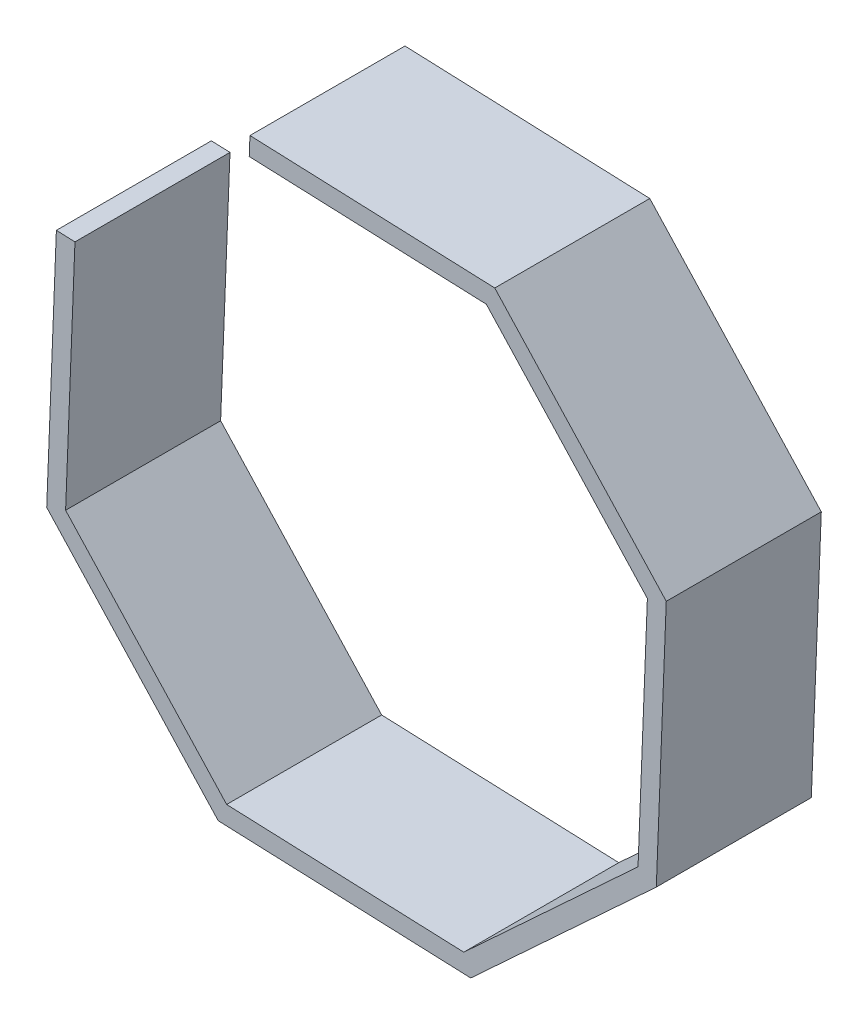
ISO-10303-21;
HEADER;
FILE_DESCRIPTION(('STEP AP214'),'2;1');
FILE_NAME('part.step','',(''),(''),'','','');
FILE_SCHEMA(('AUTOMOTIVE_DESIGN { 1 0 10303 214 1 1 1 1 }'));
ENDSEC;
DATA;
#1=APPLICATION_CONTEXT('core data for automotive mechanical design processes');
#2=APPLICATION_PROTOCOL_DEFINITION('international standard','automotive_design',2000,#1);
#3=PRODUCT_CONTEXT('',#1,'mechanical');
#4=PRODUCT('Part','Part','',(#3));
#5=PRODUCT_RELATED_PRODUCT_CATEGORY('part','',(#4));
#6=PRODUCT_DEFINITION_FORMATION('','',#4);
#7=PRODUCT_DEFINITION_CONTEXT('part definition',#1,'design');
#8=PRODUCT_DEFINITION('design','',#6,#7);
#9=PRODUCT_DEFINITION_SHAPE('','',#8);
#10=(LENGTH_UNIT() NAMED_UNIT(*) SI_UNIT(.MILLI.,.METRE.));
#11=(NAMED_UNIT(*) PLANE_ANGLE_UNIT() SI_UNIT($,.RADIAN.));
#12=(NAMED_UNIT(*) SI_UNIT($,.STERADIAN.) SOLID_ANGLE_UNIT());
#13=UNCERTAINTY_MEASURE_WITH_UNIT(LENGTH_MEASURE(1.E-05),#10,'distance_accuracy_value','');
#14=(GEOMETRIC_REPRESENTATION_CONTEXT(3) GLOBAL_UNCERTAINTY_ASSIGNED_CONTEXT((#13)) GLOBAL_UNIT_ASSIGNED_CONTEXT((#10,
#11,#12)) REPRESENTATION_CONTEXT('',''));
#15=CARTESIAN_POINT('',(0.,0.,0.));
#16=DIRECTION('',(0.,0.,1.));
#17=DIRECTION('',(1.,0.,0.));
#18=AXIS2_PLACEMENT_3D('',#15,#16,#17);
#19=CARTESIAN_POINT('',(21.0583913419168,48.4015290444842,25.));
#20=DIRECTION('',(-0.0394172251350906,-0.999222839191864,0.));
#21=DIRECTION('',(0.999222839191864,-0.0394172251350906,0.));
#22=AXIS2_PLACEMENT_3D('',#19,#20,#21);
#23=PLANE('',#22);
#24=DIRECTION('',(-0.999222839191864,0.0394172251350906,0.));
#25=VECTOR('',#24,1.);
#26=CARTESIAN_POINT('',(21.0583913419168,48.4015290444842,0.));
#27=LINE('',#26,#25);
#28=CARTESIAN_POINT('',(22.3000662973954,48.352547596758,0.));
#29=VERTEX_POINT('',#28);
#30=CARTESIAN_POINT('',(-17.1802112380363,49.9099609453846,0.));
#31=VERTEX_POINT('',#30);
#32=EDGE_CURVE('E176',#29,#31,#27,.T.);
#33=ORIENTED_EDGE('',*,*,#32,.T.);
#34=DIRECTION('',(0.,0.,-1.));
#35=VECTOR('',#34,1.);
#36=CARTESIAN_POINT('',(-17.1802112380363,49.9099609453846,25.));
#37=LINE('',#36,#35);
#38=CARTESIAN_POINT('',(-17.1802112380363,49.9099609453846,25.));
#39=VERTEX_POINT('',#38);
#40=EDGE_CURVE('E11',#39,#31,#37,.T.);
#41=ORIENTED_EDGE('',*,*,#40,.F.);
#42=DIRECTION('',(-0.999222839191864,0.0394172251350906,0.));
#43=VECTOR('',#42,1.);
#44=CARTESIAN_POINT('',(21.0583913419168,48.4015290444842,25.));
#45=LINE('',#44,#43);
#46=CARTESIAN_POINT('',(22.3000662973954,48.352547596758,25.));
#47=VERTEX_POINT('',#46);
#48=EDGE_CURVE('E113',#47,#39,#45,.T.);
#49=ORIENTED_EDGE('',*,*,#48,.F.);
#50=DIRECTION('',(0.,0.,-1.));
#51=VECTOR('',#50,1.);
#52=CARTESIAN_POINT('',(22.3000662973954,48.352547596758,25.));
#53=LINE('',#52,#51);
#54=EDGE_CURVE('E172',#47,#29,#53,.T.);
#55=ORIENTED_EDGE('',*,*,#54,.T.);
#56=EDGE_LOOP('',(#33,#41,#49,#55));
#57=FACE_BOUND('',#56,.T.);
#58=ADVANCED_FACE('F33',(#57),#23,.F.);
#59=CARTESIAN_POINT('',(-17.2984629134416,46.912292427809,25.));
#60=DIRECTION('',(-0.999222839191864,0.039417225135091,0.));
#61=DIRECTION('',(-0.039417225135091,-0.999222839191864,0.));
#62=AXIS2_PLACEMENT_3D('',#59,#60,#61);
#63=PLANE('',#62);
#64=DIRECTION('',(0.039417225135091,0.999222839191864,0.));
#65=VECTOR('',#64,1.);
#66=CARTESIAN_POINT('',(-17.2984629134416,46.912292427809,0.));
#67=LINE('',#66,#65);
#68=CARTESIAN_POINT('',(-17.2984629134416,46.912292427809,0.));
#69=VERTEX_POINT('',#68);
#70=EDGE_CURVE('E179',#69,#31,#67,.T.);
#71=ORIENTED_EDGE('',*,*,#70,.F.);
#72=DIRECTION('',(0.,0.,-1.));
#73=VECTOR('',#72,1.);
#74=CARTESIAN_POINT('',(-17.2984629134416,46.912292427809,25.));
#75=LINE('',#74,#73);
#76=CARTESIAN_POINT('',(-17.2984629134416,46.912292427809,25.));
#77=VERTEX_POINT('',#76);
#78=EDGE_CURVE('E41',#77,#69,#75,.T.);
#79=ORIENTED_EDGE('',*,*,#78,.F.);
#80=DIRECTION('',(0.039417225135091,0.999222839191864,0.));
#81=VECTOR('',#80,1.);
#82=CARTESIAN_POINT('',(-17.2984629134416,46.912292427809,25.));
#83=LINE('',#82,#81);
#84=EDGE_CURVE('E261',#77,#39,#83,.T.);
#85=ORIENTED_EDGE('',*,*,#84,.T.);
#86=ORIENTED_EDGE('',*,*,#40,.T.);
#87=EDGE_LOOP('',(#71,#79,#85,#86));
#88=FACE_BOUND('',#87,.T.);
#89=ADVANCED_FACE('F248',(#88),#63,.T.);
#90=CARTESIAN_POINT('',(20.9401396665115,45.4038605269086,25.));
#91=DIRECTION('',(-0.0394172251350906,-0.999222839191864,0.));
#92=DIRECTION('',(0.999222839191864,-0.0394172251350906,0.));
#93=AXIS2_PLACEMENT_3D('',#90,#91,#92);
#94=PLANE('',#93);
#95=DIRECTION('',(-0.999222839191864,0.0394172251350906,0.));
#96=VECTOR('',#95,1.);
#97=CARTESIAN_POINT('',(20.9401396665115,45.4038605269086,0.));
#98=LINE('',#97,#96);
#99=CARTESIAN_POINT('',(20.9401396665115,45.4038605269086,0.));
#100=VERTEX_POINT('',#99);
#101=EDGE_CURVE('E182',#100,#69,#98,.T.);
#102=ORIENTED_EDGE('',*,*,#101,.F.);
#103=DIRECTION('',(0.,0.,-1.));
#104=VECTOR('',#103,1.);
#105=CARTESIAN_POINT('',(20.9401396665115,45.4038605269086,25.));
#106=LINE('',#105,#104);
#107=CARTESIAN_POINT('',(20.9401396665115,45.4038605269086,25.));
#108=VERTEX_POINT('',#107);
#109=EDGE_CURVE('E238',#108,#100,#106,.T.);
#110=ORIENTED_EDGE('',*,*,#109,.F.);
#111=DIRECTION('',(-0.999222839191864,0.0394172251350906,0.));
#112=VECTOR('',#111,1.);
#113=CARTESIAN_POINT('',(20.9401396665115,45.4038605269086,25.));
#114=LINE('',#113,#112);
#115=EDGE_CURVE('E245',#108,#77,#114,.T.);
#116=ORIENTED_EDGE('',*,*,#115,.T.);
#117=ORIENTED_EDGE('',*,*,#78,.T.);
#118=EDGE_LOOP('',(#102,#110,#116,#117));
#119=FACE_BOUND('',#118,.T.);
#120=ADVANCED_FACE('F243',(#119),#94,.T.);
#121=CARTESIAN_POINT('',(46.9122924278089,17.2984629134416,25.));
#122=DIRECTION('',(-0.734429432697622,-0.678685058320463,0.));
#123=DIRECTION('',(0.678685058320463,-0.734429432697622,0.));
#124=AXIS2_PLACEMENT_3D('',#121,#122,#123);
#125=PLANE('',#124);
#126=DIRECTION('',(-0.678685058320463,0.734429432697622,0.));
#127=VECTOR('',#126,1.);
#128=CARTESIAN_POINT('',(46.9122924278089,17.2984629134416,0.));
#129=LINE('',#128,#127);
#130=CARTESIAN_POINT('',(46.9122924278089,17.2984629134416,0.));
#131=VERTEX_POINT('',#130);
#132=EDGE_CURVE('E185',#131,#100,#129,.T.);
#133=ORIENTED_EDGE('',*,*,#132,.F.);
#134=DIRECTION('',(0.,0.,-1.));
#135=VECTOR('',#134,1.);
#136=CARTESIAN_POINT('',(46.9122924278089,17.2984629134416,25.));
#137=LINE('',#136,#135);
#138=CARTESIAN_POINT('',(46.9122924278089,17.2984629134416,25.));
#139=VERTEX_POINT('',#138);
#140=EDGE_CURVE('E236',#139,#131,#137,.T.);
#141=ORIENTED_EDGE('',*,*,#140,.F.);
#142=DIRECTION('',(-0.678685058320463,0.734429432697622,0.));
#143=VECTOR('',#142,1.);
#144=CARTESIAN_POINT('',(46.9122924278089,17.2984629134416,25.));
#145=LINE('',#144,#143);
#146=EDGE_CURVE('E258',#139,#108,#145,.T.);
#147=ORIENTED_EDGE('',*,*,#146,.T.);
#148=ORIENTED_EDGE('',*,*,#109,.T.);
#149=EDGE_LOOP('',(#133,#141,#147,#148));
#150=FACE_BOUND('',#149,.T.);
#151=ADVANCED_FACE('F255',(#150),#125,.T.);
#152=CARTESIAN_POINT('',(45.4038605269086,-20.9401396665115,25.));
#153=DIRECTION('',(-0.999222839191864,0.0394172251350904,0.));
#154=DIRECTION('',(-0.0394172251350904,-0.999222839191864,0.));
#155=AXIS2_PLACEMENT_3D('',#152,#153,#154);
#156=PLANE('',#155);
#157=DIRECTION('',(0.0394172251350904,0.999222839191864,0.));
#158=VECTOR('',#157,1.);
#159=CARTESIAN_POINT('',(45.4038605269086,-20.9401396665115,0.));
#160=LINE('',#159,#158);
#161=CARTESIAN_POINT('',(45.4038605269086,-20.9401396665115,0.));
#162=VERTEX_POINT('',#161);
#163=EDGE_CURVE('E188',#162,#131,#160,.T.);
#164=ORIENTED_EDGE('',*,*,#163,.F.);
#165=DIRECTION('',(0.,0.,-1.));
#166=VECTOR('',#165,1.);
#167=CARTESIAN_POINT('',(45.4038605269086,-20.9401396665115,25.));
#168=LINE('',#167,#166);
#169=CARTESIAN_POINT('',(45.4038605269086,-20.9401396665115,25.));
#170=VERTEX_POINT('',#169);
#171=EDGE_CURVE('E234',#170,#162,#168,.T.);
#172=ORIENTED_EDGE('',*,*,#171,.F.);
#173=DIRECTION('',(0.0394172251350904,0.999222839191864,0.));
#174=VECTOR('',#173,1.);
#175=CARTESIAN_POINT('',(45.4038605269086,-20.9401396665115,25.));
#176=LINE('',#175,#174);
#177=EDGE_CURVE('E263',#170,#139,#176,.T.);
#178=ORIENTED_EDGE('',*,*,#177,.T.);
#179=ORIENTED_EDGE('',*,*,#140,.T.);
#180=EDGE_LOOP('',(#164,#172,#178,#179));
#181=FACE_BOUND('',#180,.T.);
#182=ADVANCED_FACE('F320',(#181),#156,.T.);
#183=CARTESIAN_POINT('',(17.2984629134416,-46.912292427809,25.));
#184=DIRECTION('',(-0.678685058320462,0.734429432697622,0.));
#185=DIRECTION('',(-0.734429432697622,-0.678685058320462,0.));
#186=AXIS2_PLACEMENT_3D('',#183,#184,#185);
#187=PLANE('',#186);
#188=DIRECTION('',(0.734429432697622,0.678685058320463,0.));
#189=VECTOR('',#188,1.);
#190=CARTESIAN_POINT('',(17.2984629134416,-46.912292427809,0.));
#191=LINE('',#190,#189);
#192=CARTESIAN_POINT('',(17.2984629134416,-46.912292427809,0.));
#193=VERTEX_POINT('',#192);
#194=EDGE_CURVE('E191',#193,#162,#191,.T.);
#195=ORIENTED_EDGE('',*,*,#194,.F.);
#196=DIRECTION('',(0.,0.,-1.));
#197=VECTOR('',#196,1.);
#198=CARTESIAN_POINT('',(17.2984629134416,-46.912292427809,25.));
#199=LINE('',#198,#197);
#200=CARTESIAN_POINT('',(17.2984629134416,-46.912292427809,25.));
#201=VERTEX_POINT('',#200);
#202=EDGE_CURVE('E232',#201,#193,#199,.T.);
#203=ORIENTED_EDGE('',*,*,#202,.F.);
#204=DIRECTION('',(0.734429432697622,0.678685058320463,0.));
#205=VECTOR('',#204,1.);
#206=CARTESIAN_POINT('',(17.2984629134416,-46.912292427809,25.));
#207=LINE('',#206,#205);
#208=EDGE_CURVE('E269',#201,#170,#207,.T.);
#209=ORIENTED_EDGE('',*,*,#208,.T.);
#210=ORIENTED_EDGE('',*,*,#171,.T.);
#211=EDGE_LOOP('',(#195,#203,#209,#210));
#212=FACE_BOUND('',#211,.T.);
#213=ADVANCED_FACE('F323',(#212),#187,.T.);
#214=CARTESIAN_POINT('',(-20.9401396665115,-45.4038605269086,25.));
#215=DIRECTION('',(0.0394172251350906,0.999222839191864,0.));
#216=DIRECTION('',(-0.999222839191864,0.0394172251350906,0.));
#217=AXIS2_PLACEMENT_3D('',#214,#215,#216);
#218=PLANE('',#217);
#219=DIRECTION('',(0.999222839191864,-0.0394172251350905,0.));
#220=VECTOR('',#219,1.);
#221=CARTESIAN_POINT('',(-20.9401396665115,-45.4038605269086,0.));
#222=LINE('',#221,#220);
#223=CARTESIAN_POINT('',(-20.9401396665115,-45.4038605269086,0.));
#224=VERTEX_POINT('',#223);
#225=EDGE_CURVE('E194',#224,#193,#222,.T.);
#226=ORIENTED_EDGE('',*,*,#225,.F.);
#227=DIRECTION('',(0.,0.,-1.));
#228=VECTOR('',#227,1.);
#229=CARTESIAN_POINT('',(-20.9401396665115,-45.4038605269086,25.));
#230=LINE('',#229,#228);
#231=CARTESIAN_POINT('',(-20.9401396665115,-45.4038605269086,25.));
#232=VERTEX_POINT('',#231);
#233=EDGE_CURVE('E230',#232,#224,#230,.T.);
#234=ORIENTED_EDGE('',*,*,#233,.F.);
#235=DIRECTION('',(0.999222839191864,-0.0394172251350905,0.));
#236=VECTOR('',#235,1.);
#237=CARTESIAN_POINT('',(-20.9401396665115,-45.4038605269086,25.));
#238=LINE('',#237,#236);
#239=EDGE_CURVE('E272',#232,#201,#238,.T.);
#240=ORIENTED_EDGE('',*,*,#239,.T.);
#241=ORIENTED_EDGE('',*,*,#202,.T.);
#242=EDGE_LOOP('',(#226,#234,#240,#241));
#243=FACE_BOUND('',#242,.T.);
#244=ADVANCED_FACE('F327',(#243),#218,.T.);
#245=CARTESIAN_POINT('',(-46.912292427809,-17.2984629134416,25.));
#246=DIRECTION('',(0.734429432697622,0.678685058320463,0.));
#247=DIRECTION('',(-0.678685058320463,0.734429432697622,0.));
#248=AXIS2_PLACEMENT_3D('',#245,#246,#247);
#249=PLANE('',#248);
#250=DIRECTION('',(0.678685058320463,-0.734429432697622,0.));
#251=VECTOR('',#250,1.);
#252=CARTESIAN_POINT('',(-46.912292427809,-17.2984629134416,0.));
#253=LINE('',#252,#251);
#254=CARTESIAN_POINT('',(-46.912292427809,-17.2984629134416,0.));
#255=VERTEX_POINT('',#254);
#256=EDGE_CURVE('E197',#255,#224,#253,.T.);
#257=ORIENTED_EDGE('',*,*,#256,.F.);
#258=DIRECTION('',(0.,0.,-1.));
#259=VECTOR('',#258,1.);
#260=CARTESIAN_POINT('',(-46.912292427809,-17.2984629134416,25.));
#261=LINE('',#260,#259);
#262=CARTESIAN_POINT('',(-46.912292427809,-17.2984629134416,25.));
#263=VERTEX_POINT('',#262);
#264=EDGE_CURVE('E228',#263,#255,#261,.T.);
#265=ORIENTED_EDGE('',*,*,#264,.F.);
#266=DIRECTION('',(0.678685058320463,-0.734429432697622,0.));
#267=VECTOR('',#266,1.);
#268=CARTESIAN_POINT('',(-46.912292427809,-17.2984629134416,25.));
#269=LINE('',#268,#267);
#270=EDGE_CURVE('E275',#263,#232,#269,.T.);
#271=ORIENTED_EDGE('',*,*,#270,.T.);
#272=ORIENTED_EDGE('',*,*,#233,.T.);
#273=EDGE_LOOP('',(#257,#265,#271,#272));
#274=FACE_BOUND('',#273,.T.);
#275=ADVANCED_FACE('F331',(#274),#249,.T.);
#276=CARTESIAN_POINT('',(-45.4038605269086,20.9401396665115,25.));
#277=DIRECTION('',(0.999222839191864,-0.0394172251350905,0.));
#278=DIRECTION('',(0.0394172251350905,0.999222839191864,0.));
#279=AXIS2_PLACEMENT_3D('',#276,#277,#278);
#280=PLANE('',#279);
#281=DIRECTION('',(-0.0394172251350905,-0.999222839191864,0.));
#282=VECTOR('',#281,1.);
#283=CARTESIAN_POINT('',(-45.4038605269086,20.9401396665115,0.));
#284=LINE('',#283,#282);
#285=CARTESIAN_POINT('',(-45.4038605269086,20.9401396665115,0.));
#286=VERTEX_POINT('',#285);
#287=EDGE_CURVE('E200',#286,#255,#284,.T.);
#288=ORIENTED_EDGE('',*,*,#287,.F.);
#289=DIRECTION('',(0.,0.,-1.));
#290=VECTOR('',#289,1.);
#291=CARTESIAN_POINT('',(-45.4038605269086,20.9401396665115,25.));
#292=LINE('',#291,#290);
#293=CARTESIAN_POINT('',(-45.4038605269086,20.9401396665115,25.));
#294=VERTEX_POINT('',#293);
#295=EDGE_CURVE('E226',#294,#286,#292,.T.);
#296=ORIENTED_EDGE('',*,*,#295,.F.);
#297=DIRECTION('',(-0.0394172251350905,-0.999222839191864,0.));
#298=VECTOR('',#297,1.);
#299=CARTESIAN_POINT('',(-45.4038605269086,20.9401396665115,25.));
#300=LINE('',#299,#298);
#301=EDGE_CURVE('E278',#294,#263,#300,.T.);
#302=ORIENTED_EDGE('',*,*,#301,.T.);
#303=ORIENTED_EDGE('',*,*,#264,.T.);
#304=EDGE_LOOP('',(#288,#296,#302,#303));
#305=FACE_BOUND('',#304,.T.);
#306=ADVANCED_FACE('F335',(#305),#280,.T.);
#307=CARTESIAN_POINT('',(-48.4015290444842,21.0583913419168,25.));
#308=DIRECTION('',(0.0394172251350911,0.999222839191864,0.));
#309=DIRECTION('',(-0.999222839191864,0.0394172251350911,0.));
#310=AXIS2_PLACEMENT_3D('',#307,#308,#309);
#311=PLANE('',#310);
#312=DIRECTION('',(0.999222839191864,-0.0394172251350911,0.));
#313=VECTOR('',#312,1.);
#314=CARTESIAN_POINT('',(-48.4015290444842,21.0583913419168,0.));
#315=LINE('',#314,#313);
#316=CARTESIAN_POINT('',(-48.4015290444842,21.0583913419168,0.));
#317=VERTEX_POINT('',#316);
#318=EDGE_CURVE('E203',#317,#286,#315,.T.);
#319=ORIENTED_EDGE('',*,*,#318,.F.);
#320=DIRECTION('',(0.,0.,-1.));
#321=VECTOR('',#320,1.);
#322=CARTESIAN_POINT('',(-48.4015290444842,21.0583913419168,25.));
#323=LINE('',#322,#321);
#324=CARTESIAN_POINT('',(-48.4015290444842,21.0583913419168,25.));
#325=VERTEX_POINT('',#324);
#326=EDGE_CURVE('E224',#325,#317,#323,.T.);
#327=ORIENTED_EDGE('',*,*,#326,.F.);
#328=DIRECTION('',(0.999222839191864,-0.0394172251350911,0.));
#329=VECTOR('',#328,1.);
#330=CARTESIAN_POINT('',(-48.4015290444842,21.0583913419168,25.));
#331=LINE('',#330,#329);
#332=EDGE_CURVE('E281',#325,#294,#331,.T.);
#333=ORIENTED_EDGE('',*,*,#332,.T.);
#334=ORIENTED_EDGE('',*,*,#295,.T.);
#335=EDGE_LOOP('',(#319,#327,#333,#334));
#336=FACE_BOUND('',#335,.T.);
#337=ADVANCED_FACE('F339',(#336),#311,.T.);
#338=CARTESIAN_POINT('',(-48.4015290444842,21.0583913419168,25.));
#339=DIRECTION('',(0.999222839191864,-0.0394172251350905,0.));
#340=DIRECTION('',(0.0394172251350905,0.999222839191864,0.));
#341=AXIS2_PLACEMENT_3D('',#338,#339,#340);
#342=PLANE('',#341);
#343=DIRECTION('',(-0.0394172251350905,-0.999222839191864,0.));
#344=VECTOR('',#343,1.);
#345=CARTESIAN_POINT('',(-48.4015290444842,21.0583913419168,0.));
#346=LINE('',#345,#344);
#347=CARTESIAN_POINT('',(-49.9589423931108,-18.421886193515,0.));
#348=VERTEX_POINT('',#347);
#349=EDGE_CURVE('E206',#317,#348,#346,.T.);
#350=ORIENTED_EDGE('',*,*,#349,.T.);
#351=DIRECTION('',(0.,0.,-1.));
#352=VECTOR('',#351,1.);
#353=CARTESIAN_POINT('',(-49.9589423931108,-18.421886193515,25.));
#354=LINE('',#353,#352);
#355=CARTESIAN_POINT('',(-49.9589423931108,-18.421886193515,25.));
#356=VERTEX_POINT('',#355);
#357=EDGE_CURVE('E221',#356,#348,#354,.T.);
#358=ORIENTED_EDGE('',*,*,#357,.F.);
#359=DIRECTION('',(-0.0394172251350905,-0.999222839191864,0.));
#360=VECTOR('',#359,1.);
#361=CARTESIAN_POINT('',(-48.4015290444842,21.0583913419168,25.));
#362=LINE('',#361,#360);
#363=EDGE_CURVE('E284',#325,#356,#362,.T.);
#364=ORIENTED_EDGE('',*,*,#363,.F.);
#365=ORIENTED_EDGE('',*,*,#326,.T.);
#366=EDGE_LOOP('',(#350,#358,#364,#365));
#367=FACE_BOUND('',#366,.T.);
#368=ADVANCED_FACE('F343',(#367),#342,.F.);
#369=CARTESIAN_POINT('',(-49.1155807259018,-19.334518088403,25.));
#370=DIRECTION('',(0.734429432697622,0.678685058320463,0.));
#371=DIRECTION('',(-0.678685058320463,0.734429432697622,0.));
#372=AXIS2_PLACEMENT_3D('',#369,#370,#371);
#373=PLANE('',#372);
#374=DIRECTION('',(0.678685058320463,-0.734429432697622,0.));
#375=VECTOR('',#374,1.);
#376=CARTESIAN_POINT('',(-49.1155807259018,-19.334518088403,0.));
#377=LINE('',#376,#375);
#378=CARTESIAN_POINT('',(-22.3000662973955,-48.352547596758,0.));
#379=VERTEX_POINT('',#378);
#380=EDGE_CURVE('E208',#348,#379,#377,.T.);
#381=ORIENTED_EDGE('',*,*,#380,.T.);
#382=DIRECTION('',(0.,0.,-1.));
#383=VECTOR('',#382,1.);
#384=CARTESIAN_POINT('',(-22.3000662973955,-48.352547596758,25.));
#385=LINE('',#384,#383);
#386=CARTESIAN_POINT('',(-22.3000662973955,-48.352547596758,25.));
#387=VERTEX_POINT('',#386);
#388=EDGE_CURVE('E218',#387,#379,#385,.T.);
#389=ORIENTED_EDGE('',*,*,#388,.F.);
#390=DIRECTION('',(0.678685058320463,-0.734429432697622,0.));
#391=VECTOR('',#390,1.);
#392=CARTESIAN_POINT('',(-49.1155807259018,-19.334518088403,25.));
#393=LINE('',#392,#391);
#394=EDGE_CURVE('E286',#356,#387,#393,.T.);
#395=ORIENTED_EDGE('',*,*,#394,.F.);
#396=ORIENTED_EDGE('',*,*,#357,.T.);
#397=EDGE_LOOP('',(#381,#389,#395,#396));
#398=FACE_BOUND('',#397,.T.);
#399=ADVANCED_FACE('F293',(#398),#373,.F.);
#400=CARTESIAN_POINT('',(-21.0583913419168,-48.4015290444842,25.));
#401=DIRECTION('',(0.0394172251350906,0.999222839191864,0.));
#402=DIRECTION('',(-0.999222839191864,0.0394172251350906,0.));
#403=AXIS2_PLACEMENT_3D('',#400,#401,#402);
#404=PLANE('',#403);
#405=DIRECTION('',(0.999222839191864,-0.0394172251350905,0.));
#406=VECTOR('',#405,1.);
#407=CARTESIAN_POINT('',(-21.0583913419168,-48.4015290444842,0.));
#408=LINE('',#407,#406);
#409=CARTESIAN_POINT('',(18.4218861935149,-49.9589423931108,0.));
#410=VERTEX_POINT('',#409);
#411=EDGE_CURVE('E210',#379,#410,#408,.T.);
#412=ORIENTED_EDGE('',*,*,#411,.T.);
#413=DIRECTION('',(0.,0.,-1.));
#414=VECTOR('',#413,1.);
#415=CARTESIAN_POINT('',(18.4218861935149,-49.9589423931108,25.));
#416=LINE('',#415,#414);
#417=CARTESIAN_POINT('',(18.4218861935149,-49.9589423931108,25.));
#418=VERTEX_POINT('',#417);
#419=EDGE_CURVE('E167',#418,#410,#416,.T.);
#420=ORIENTED_EDGE('',*,*,#419,.F.);
#421=DIRECTION('',(0.999222839191864,-0.0394172251350905,0.));
#422=VECTOR('',#421,1.);
#423=CARTESIAN_POINT('',(-21.0583913419168,-48.4015290444842,25.));
#424=LINE('',#423,#422);
#425=EDGE_CURVE('E158',#387,#418,#424,.T.);
#426=ORIENTED_EDGE('',*,*,#425,.F.);
#427=ORIENTED_EDGE('',*,*,#388,.T.);
#428=EDGE_LOOP('',(#412,#420,#426,#427));
#429=FACE_BOUND('',#428,.T.);
#430=ADVANCED_FACE('F297',(#429),#404,.F.);
#431=CARTESIAN_POINT('',(19.3345180884029,-49.1155807259018,25.));
#432=DIRECTION('',(-0.678685058320462,0.734429432697622,0.));
#433=DIRECTION('',(-0.734429432697622,-0.678685058320462,0.));
#434=AXIS2_PLACEMENT_3D('',#431,#432,#433);
#435=PLANE('',#434);
#436=DIRECTION('',(0.734429432697622,0.678685058320462,0.));
#437=VECTOR('',#436,1.);
#438=CARTESIAN_POINT('',(19.3345180884029,-49.1155807259018,0.));
#439=LINE('',#438,#437);
#440=CARTESIAN_POINT('',(48.352547596758,-22.3000662973954,0.));
#441=VERTEX_POINT('',#440);
#442=EDGE_CURVE('E166',#410,#441,#439,.T.);
#443=ORIENTED_EDGE('',*,*,#442,.T.);
#444=DIRECTION('',(0.,0.,-1.));
#445=VECTOR('',#444,1.);
#446=CARTESIAN_POINT('',(48.352547596758,-22.3000662973954,25.));
#447=LINE('',#446,#445);
#448=CARTESIAN_POINT('',(48.352547596758,-22.3000662973954,25.));
#449=VERTEX_POINT('',#448);
#450=EDGE_CURVE('E163',#449,#441,#447,.T.);
#451=ORIENTED_EDGE('',*,*,#450,.F.);
#452=DIRECTION('',(0.734429432697622,0.678685058320462,0.));
#453=VECTOR('',#452,1.);
#454=CARTESIAN_POINT('',(19.3345180884029,-49.1155807259018,25.));
#455=LINE('',#454,#453);
#456=EDGE_CURVE('E152',#418,#449,#455,.T.);
#457=ORIENTED_EDGE('',*,*,#456,.F.);
#458=ORIENTED_EDGE('',*,*,#419,.T.);
#459=EDGE_LOOP('',(#443,#451,#457,#458));
#460=FACE_BOUND('',#459,.T.);
#461=ADVANCED_FACE('F164',(#460),#435,.F.);
#462=CARTESIAN_POINT('',(48.4015290444842,-21.0583913419168,25.));
#463=DIRECTION('',(-0.999222839191864,0.0394172251350904,0.));
#464=DIRECTION('',(-0.0394172251350904,-0.999222839191864,0.));
#465=AXIS2_PLACEMENT_3D('',#462,#463,#464);
#466=PLANE('',#465);
#467=DIRECTION('',(0.0394172251350904,0.999222839191864,0.));
#468=VECTOR('',#467,1.);
#469=CARTESIAN_POINT('',(48.4015290444842,-21.0583913419168,0.));
#470=LINE('',#469,#468);
#471=CARTESIAN_POINT('',(49.9589423931108,18.421886193515,0.));
#472=VERTEX_POINT('',#471);
#473=EDGE_CURVE('E101',#441,#472,#470,.T.);
#474=ORIENTED_EDGE('',*,*,#473,.T.);
#475=DIRECTION('',(0.,0.,-1.));
#476=VECTOR('',#475,1.);
#477=CARTESIAN_POINT('',(49.9589423931108,18.421886193515,25.));
#478=LINE('',#477,#476);
#479=CARTESIAN_POINT('',(49.9589423931108,18.421886193515,25.));
#480=VERTEX_POINT('',#479);
#481=EDGE_CURVE('E168',#480,#472,#478,.T.);
#482=ORIENTED_EDGE('',*,*,#481,.F.);
#483=DIRECTION('',(0.0394172251350904,0.999222839191864,0.));
#484=VECTOR('',#483,1.);
#485=CARTESIAN_POINT('',(48.4015290444842,-21.0583913419168,25.));
#486=LINE('',#485,#484);
#487=EDGE_CURVE('E156',#449,#480,#486,.T.);
#488=ORIENTED_EDGE('',*,*,#487,.F.);
#489=ORIENTED_EDGE('',*,*,#450,.T.);
#490=EDGE_LOOP('',(#474,#482,#488,#489));
#491=FACE_BOUND('',#490,.T.);
#492=ADVANCED_FACE('F170',(#491),#466,.F.);
#493=CARTESIAN_POINT('',(49.1155807259018,19.334518088403,25.));
#494=DIRECTION('',(-0.734429432697622,-0.678685058320463,0.));
#495=DIRECTION('',(0.678685058320463,-0.734429432697622,0.));
#496=AXIS2_PLACEMENT_3D('',#493,#494,#495);
#497=PLANE('',#496);
#498=DIRECTION('',(-0.678685058320463,0.734429432697622,0.));
#499=VECTOR('',#498,1.);
#500=CARTESIAN_POINT('',(49.1155807259018,19.334518088403,0.));
#501=LINE('',#500,#499);
#502=EDGE_CURVE('E107',#472,#29,#501,.T.);
#503=ORIENTED_EDGE('',*,*,#502,.T.);
#504=ORIENTED_EDGE('',*,*,#54,.F.);
#505=DIRECTION('',(-0.678685058320463,0.734429432697622,0.));
#506=VECTOR('',#505,1.);
#507=CARTESIAN_POINT('',(49.1155807259018,19.334518088403,25.));
#508=LINE('',#507,#506);
#509=EDGE_CURVE('E49',#480,#47,#508,.T.);
#510=ORIENTED_EDGE('',*,*,#509,.F.);
#511=ORIENTED_EDGE('',*,*,#481,.T.);
#512=EDGE_LOOP('',(#503,#504,#510,#511));
#513=FACE_BOUND('',#512,.T.);
#514=ADVANCED_FACE('F299',(#513),#497,.F.);
#515=CARTESIAN_POINT('',(0.,0.,25.));
#516=DIRECTION('',(0.,0.,-1.));
#517=DIRECTION('',(-1.,0.,0.));
#518=AXIS2_PLACEMENT_3D('',#515,#516,#517);
#519=PLANE('',#518);
#520=ORIENTED_EDGE('',*,*,#48,.T.);
#521=ORIENTED_EDGE('',*,*,#84,.F.);
#522=ORIENTED_EDGE('',*,*,#115,.F.);
#523=ORIENTED_EDGE('',*,*,#146,.F.);
#524=ORIENTED_EDGE('',*,*,#177,.F.);
#525=ORIENTED_EDGE('',*,*,#208,.F.);
#526=ORIENTED_EDGE('',*,*,#239,.F.);
#527=ORIENTED_EDGE('',*,*,#270,.F.);
#528=ORIENTED_EDGE('',*,*,#301,.F.);
#529=ORIENTED_EDGE('',*,*,#332,.F.);
#530=ORIENTED_EDGE('',*,*,#363,.T.);
#531=ORIENTED_EDGE('',*,*,#394,.T.);
#532=ORIENTED_EDGE('',*,*,#425,.T.);
#533=ORIENTED_EDGE('',*,*,#456,.T.);
#534=ORIENTED_EDGE('',*,*,#487,.T.);
#535=ORIENTED_EDGE('',*,*,#509,.T.);
#536=EDGE_LOOP('',(#520,#521,#522,#523,#524,#525,#526,#527,#528,#529,#530,#531,#532,#533,#534,#535));
#537=FACE_BOUND('',#536,.T.);
#538=ADVANCED_FACE('F154',(#537),#519,.F.);
#539=CARTESIAN_POINT('',(0.,0.,0.));
#540=DIRECTION('',(0.,0.,-1.));
#541=DIRECTION('',(-1.,0.,0.));
#542=AXIS2_PLACEMENT_3D('',#539,#540,#541);
#543=PLANE('',#542);
#544=ORIENTED_EDGE('',*,*,#32,.F.);
#545=ORIENTED_EDGE('',*,*,#502,.F.);
#546=ORIENTED_EDGE('',*,*,#473,.F.);
#547=ORIENTED_EDGE('',*,*,#442,.F.);
#548=ORIENTED_EDGE('',*,*,#411,.F.);
#549=ORIENTED_EDGE('',*,*,#380,.F.);
#550=ORIENTED_EDGE('',*,*,#349,.F.);
#551=ORIENTED_EDGE('',*,*,#318,.T.);
#552=ORIENTED_EDGE('',*,*,#287,.T.);
#553=ORIENTED_EDGE('',*,*,#256,.T.);
#554=ORIENTED_EDGE('',*,*,#225,.T.);
#555=ORIENTED_EDGE('',*,*,#194,.T.);
#556=ORIENTED_EDGE('',*,*,#163,.T.);
#557=ORIENTED_EDGE('',*,*,#132,.T.);
#558=ORIENTED_EDGE('',*,*,#101,.T.);
#559=ORIENTED_EDGE('',*,*,#70,.T.);
#560=EDGE_LOOP('',(#544,#545,#546,#547,#548,#549,#550,#551,#552,#553,#554,#555,#556,#557,#558,#559));
#561=FACE_BOUND('',#560,.T.);
#562=ADVANCED_FACE('F251',(#561),#543,.T.);
#563=CLOSED_SHELL('',(#58,#89,#120,#151,#182,#213,#244,#275,#306,#337,#368,#399,#430,#461,#492,
#514,#538,#562));
#564=MANIFOLD_SOLID_BREP('B2',#563);
#565=ADVANCED_BREP_SHAPE_REPRESENTATION('',(#18,#564),#14);
#566=SHAPE_DEFINITION_REPRESENTATION(#9,#565);
ENDSEC;
END-ISO-10303-21;
